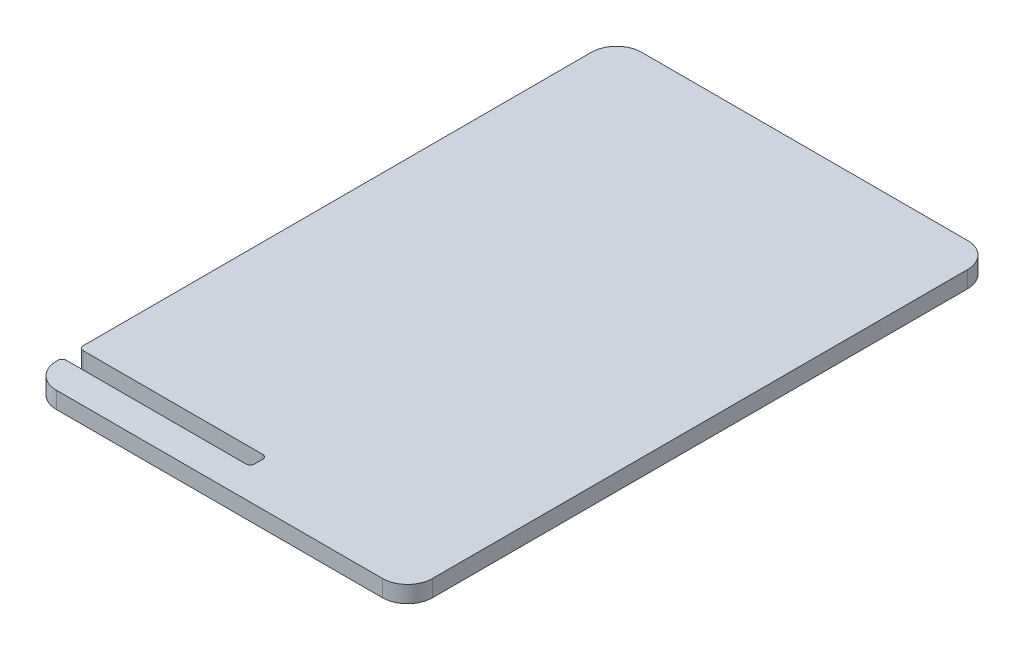
ISO-10303-21;
HEADER;
FILE_DESCRIPTION(('STEP AP214'),'2;1');
FILE_NAME('part.step','',(''),(''),'','','');
FILE_SCHEMA(('AUTOMOTIVE_DESIGN { 1 0 10303 214 1 1 1 1 }'));
ENDSEC;
DATA;
#1=APPLICATION_CONTEXT('core data for automotive mechanical design processes');
#2=APPLICATION_PROTOCOL_DEFINITION('international standard','automotive_design',2000,#1);
#3=PRODUCT_CONTEXT('',#1,'mechanical');
#4=PRODUCT('Part','Part','',(#3));
#5=PRODUCT_RELATED_PRODUCT_CATEGORY('part','',(#4));
#6=PRODUCT_DEFINITION_FORMATION('','',#4);
#7=PRODUCT_DEFINITION_CONTEXT('part definition',#1,'design');
#8=PRODUCT_DEFINITION('design','',#6,#7);
#9=PRODUCT_DEFINITION_SHAPE('','',#8);
#10=(LENGTH_UNIT() NAMED_UNIT(*) SI_UNIT(.MILLI.,.METRE.));
#11=(NAMED_UNIT(*) PLANE_ANGLE_UNIT() SI_UNIT($,.RADIAN.));
#12=(NAMED_UNIT(*) SI_UNIT($,.STERADIAN.) SOLID_ANGLE_UNIT());
#13=UNCERTAINTY_MEASURE_WITH_UNIT(LENGTH_MEASURE(1.E-05),#10,'distance_accuracy_value','');
#14=(GEOMETRIC_REPRESENTATION_CONTEXT(3) GLOBAL_UNCERTAINTY_ASSIGNED_CONTEXT((#13)) GLOBAL_UNIT_ASSIGNED_CONTEXT((#10,
#11,#12)) REPRESENTATION_CONTEXT('',''));
#15=CARTESIAN_POINT('',(0.,0.,0.));
#16=DIRECTION('',(0.,0.,1.));
#17=DIRECTION('',(1.,0.,0.));
#18=AXIS2_PLACEMENT_3D('',#15,#16,#17);
#19=CARTESIAN_POINT('',(-22.5,2.,-35.3062315740794));
#20=DIRECTION('',(1.,0.,0.));
#21=DIRECTION('',(0.,0.,-1.));
#22=AXIS2_PLACEMENT_3D('',#19,#20,#21);
#23=PLANE('',#22);
#24=DIRECTION('',(0.,0.,1.));
#25=VECTOR('',#24,1.);
#26=CARTESIAN_POINT('',(-22.5,0.,-35.3062315740794));
#27=LINE('',#26,#25);
#28=CARTESIAN_POINT('',(-22.5,0.,-32.3062315740794));
#29=VERTEX_POINT('',#28);
#30=CARTESIAN_POINT('',(-22.5,0.,28.5));
#31=VERTEX_POINT('',#30);
#32=EDGE_CURVE('E186',#29,#31,#27,.T.);
#33=ORIENTED_EDGE('',*,*,#32,.T.);
#34=DIRECTION('',(0.,1.,0.));
#35=VECTOR('',#34,1.);
#36=CARTESIAN_POINT('',(-22.5,2.,28.5));
#37=LINE('',#36,#35);
#38=CARTESIAN_POINT('',(-22.5,2.,28.5));
#39=VERTEX_POINT('',#38);
#40=EDGE_CURVE('E278',#31,#39,#37,.T.);
#41=ORIENTED_EDGE('',*,*,#40,.T.);
#42=DIRECTION('',(0.,0.,1.));
#43=VECTOR('',#42,1.);
#44=CARTESIAN_POINT('',(-22.5,2.,-35.3062315740794));
#45=LINE('',#44,#43);
#46=CARTESIAN_POINT('',(-22.5,2.,-32.3062315740794));
#47=VERTEX_POINT('',#46);
#48=EDGE_CURVE('E327',#47,#39,#45,.T.);
#49=ORIENTED_EDGE('',*,*,#48,.F.);
#50=DIRECTION('',(0.,-1.,0.));
#51=VECTOR('',#50,1.);
#52=CARTESIAN_POINT('',(-22.5,2.,-32.3062315740794));
#53=LINE('',#52,#51);
#54=EDGE_CURVE('E232',#47,#29,#53,.T.);
#55=ORIENTED_EDGE('',*,*,#54,.T.);
#56=EDGE_LOOP('',(#33,#41,#49,#55));
#57=FACE_BOUND('',#56,.T.);
#58=ADVANCED_FACE('F43',(#57),#23,.F.);
#59=CARTESIAN_POINT('',(-22.5,2.,31.5));
#60=VERTEX_POINT('',#59);
#61=CARTESIAN_POINT('',(-22.5,2.,31.6937684259206));
#62=VERTEX_POINT('',#61);
#63=EDGE_CURVE('E200',#60,#62,#45,.T.);
#64=ORIENTED_EDGE('',*,*,#63,.F.);
#65=DIRECTION('',(0.,1.,0.));
#66=VECTOR('',#65,1.);
#67=CARTESIAN_POINT('',(-22.5,2.,31.5));
#68=LINE('',#67,#66);
#69=CARTESIAN_POINT('',(-22.5,0.,31.5));
#70=VERTEX_POINT('',#69);
#71=EDGE_CURVE('E256',#60,#70,#68,.F.);
#72=ORIENTED_EDGE('',*,*,#71,.T.);
#73=CARTESIAN_POINT('',(-22.5,0.,31.6937684259206));
#74=VERTEX_POINT('',#73);
#75=EDGE_CURVE('E193',#70,#74,#27,.T.);
#76=ORIENTED_EDGE('',*,*,#75,.T.);
#77=DIRECTION('',(0.,-1.,0.));
#78=VECTOR('',#77,1.);
#79=CARTESIAN_POINT('',(-22.5,2.,31.6937684259206));
#80=LINE('',#79,#78);
#81=EDGE_CURVE('E164',#74,#62,#80,.F.);
#82=ORIENTED_EDGE('',*,*,#81,.T.);
#83=EDGE_LOOP('',(#64,#72,#76,#82));
#84=FACE_BOUND('',#83,.T.);
#85=ADVANCED_FACE('F366',(#84),#23,.F.);
#86=CARTESIAN_POINT('',(-22.5,2.,34.6937684259206));
#87=DIRECTION('',(0.,0.,-1.));
#88=DIRECTION('',(-1.,0.,0.));
#89=AXIS2_PLACEMENT_3D('',#86,#87,#88);
#90=PLANE('',#89);
#91=DIRECTION('',(1.,0.,0.));
#92=VECTOR('',#91,1.);
#93=CARTESIAN_POINT('',(-22.5,2.,34.6937684259206));
#94=LINE('',#93,#92);
#95=CARTESIAN_POINT('',(-19.5,2.,34.6937684259206));
#96=VERTEX_POINT('',#95);
#97=CARTESIAN_POINT('',(19.5,2.,34.6937684259206));
#98=VERTEX_POINT('',#97);
#99=EDGE_CURVE('E177',#96,#98,#94,.T.);
#100=ORIENTED_EDGE('',*,*,#99,.F.);
#101=DIRECTION('',(0.,-1.,0.));
#102=VECTOR('',#101,1.);
#103=CARTESIAN_POINT('',(-19.5,2.,34.6937684259206));
#104=LINE('',#103,#102);
#105=CARTESIAN_POINT('',(-19.5,0.,34.6937684259206));
#106=VERTEX_POINT('',#105);
#107=EDGE_CURVE('E162',#96,#106,#104,.T.);
#108=ORIENTED_EDGE('',*,*,#107,.T.);
#109=DIRECTION('',(1.,0.,0.));
#110=VECTOR('',#109,1.);
#111=CARTESIAN_POINT('',(-22.5,0.,34.6937684259206));
#112=LINE('',#111,#110);
#113=CARTESIAN_POINT('',(19.5,0.,34.6937684259206));
#114=VERTEX_POINT('',#113);
#115=EDGE_CURVE('E174',#106,#114,#112,.T.);
#116=ORIENTED_EDGE('',*,*,#115,.T.);
#117=DIRECTION('',(0.,-1.,0.));
#118=VECTOR('',#117,1.);
#119=CARTESIAN_POINT('',(19.5,2.,34.6937684259206));
#120=LINE('',#119,#118);
#121=EDGE_CURVE('E180',#114,#98,#120,.F.);
#122=ORIENTED_EDGE('',*,*,#121,.T.);
#123=EDGE_LOOP('',(#100,#108,#116,#122));
#124=FACE_BOUND('',#123,.T.);
#125=ADVANCED_FACE('F173',(#124),#90,.F.);
#126=CARTESIAN_POINT('',(22.5,2.,-35.3062315740794));
#127=DIRECTION('',(-1.,0.,0.));
#128=DIRECTION('',(0.,0.,1.));
#129=AXIS2_PLACEMENT_3D('',#126,#127,#128);
#130=PLANE('',#129);
#131=DIRECTION('',(0.,0.,-1.));
#132=VECTOR('',#131,1.);
#133=CARTESIAN_POINT('',(22.5,2.,-35.3062315740794));
#134=LINE('',#133,#132);
#135=CARTESIAN_POINT('',(22.5,2.,31.6937684259206));
#136=VERTEX_POINT('',#135);
#137=CARTESIAN_POINT('',(22.5,2.,-32.3062315740794));
#138=VERTEX_POINT('',#137);
#139=EDGE_CURVE('E333',#136,#138,#134,.T.);
#140=ORIENTED_EDGE('',*,*,#139,.F.);
#141=DIRECTION('',(0.,-1.,0.));
#142=VECTOR('',#141,1.);
#143=CARTESIAN_POINT('',(22.5,2.,31.6937684259206));
#144=LINE('',#143,#142);
#145=CARTESIAN_POINT('',(22.5,0.,31.6937684259206));
#146=VERTEX_POINT('',#145);
#147=EDGE_CURVE('E228',#136,#146,#144,.T.);
#148=ORIENTED_EDGE('',*,*,#147,.T.);
#149=DIRECTION('',(0.,0.,-1.));
#150=VECTOR('',#149,1.);
#151=CARTESIAN_POINT('',(22.5,0.,-35.3062315740794));
#152=LINE('',#151,#150);
#153=CARTESIAN_POINT('',(22.5,0.,-32.3062315740794));
#154=VERTEX_POINT('',#153);
#155=EDGE_CURVE('E185',#146,#154,#152,.T.);
#156=ORIENTED_EDGE('',*,*,#155,.T.);
#157=DIRECTION('',(0.,-1.,0.));
#158=VECTOR('',#157,1.);
#159=CARTESIAN_POINT('',(22.5,2.,-32.3062315740794));
#160=LINE('',#159,#158);
#161=EDGE_CURVE('E225',#154,#138,#160,.F.);
#162=ORIENTED_EDGE('',*,*,#161,.T.);
#163=EDGE_LOOP('',(#140,#148,#156,#162));
#164=FACE_BOUND('',#163,.T.);
#165=ADVANCED_FACE('F357',(#164),#130,.F.);
#166=CARTESIAN_POINT('',(-22.5,2.,-35.3062315740794));
#167=DIRECTION('',(0.,0.,1.));
#168=DIRECTION('',(1.,0.,0.));
#169=AXIS2_PLACEMENT_3D('',#166,#167,#168);
#170=PLANE('',#169);
#171=DIRECTION('',(-1.,0.,0.));
#172=VECTOR('',#171,1.);
#173=CARTESIAN_POINT('',(-22.5,0.,-35.3062315740794));
#174=LINE('',#173,#172);
#175=CARTESIAN_POINT('',(19.5,0.,-35.3062315740794));
#176=VERTEX_POINT('',#175);
#177=CARTESIAN_POINT('',(-19.5,0.,-35.3062315740794));
#178=VERTEX_POINT('',#177);
#179=EDGE_CURVE('E191',#176,#178,#174,.T.);
#180=ORIENTED_EDGE('',*,*,#179,.T.);
#181=DIRECTION('',(0.,-1.,0.));
#182=VECTOR('',#181,1.);
#183=CARTESIAN_POINT('',(-19.5,2.,-35.3062315740794));
#184=LINE('',#183,#182);
#185=CARTESIAN_POINT('',(-19.5,2.,-35.3062315740794));
#186=VERTEX_POINT('',#185);
#187=EDGE_CURVE('E240',#178,#186,#184,.F.);
#188=ORIENTED_EDGE('',*,*,#187,.T.);
#189=DIRECTION('',(-1.,0.,0.));
#190=VECTOR('',#189,1.);
#191=CARTESIAN_POINT('',(-22.5,2.,-35.3062315740794));
#192=LINE('',#191,#190);
#193=CARTESIAN_POINT('',(19.5,2.,-35.3062315740794));
#194=VERTEX_POINT('',#193);
#195=EDGE_CURVE('E202',#194,#186,#192,.T.);
#196=ORIENTED_EDGE('',*,*,#195,.F.);
#197=DIRECTION('',(0.,-1.,0.));
#198=VECTOR('',#197,1.);
#199=CARTESIAN_POINT('',(19.5,2.,-35.3062315740794));
#200=LINE('',#199,#198);
#201=EDGE_CURVE('E236',#194,#176,#200,.T.);
#202=ORIENTED_EDGE('',*,*,#201,.T.);
#203=EDGE_LOOP('',(#180,#188,#196,#202));
#204=FACE_BOUND('',#203,.T.);
#205=ADVANCED_FACE('F351',(#204),#170,.F.);
#206=CARTESIAN_POINT('',(0.,2.,0.));
#207=DIRECTION('',(0.,1.,0.));
#208=DIRECTION('',(0.,0.,1.));
#209=AXIS2_PLACEMENT_3D('',#206,#207,#208);
#210=PLANE('',#209);
#211=DIRECTION('',(1.,0.,0.));
#212=VECTOR('',#211,1.);
#213=CARTESIAN_POINT('',(-22.5,2.,31.));
#214=LINE('',#213,#212);
#215=CARTESIAN_POINT('',(-22.,2.,31.));
#216=VERTEX_POINT('',#215);
#217=CARTESIAN_POINT('',(-0.500000000000007,2.,31.));
#218=VERTEX_POINT('',#217);
#219=EDGE_CURVE('E305',#216,#218,#214,.T.);
#220=ORIENTED_EDGE('',*,*,#219,.F.);
#221=CARTESIAN_POINT('',(-22.,2.,31.5));
#222=DIRECTION('',(0.,1.,0.));
#223=DIRECTION('',(0.,0.,1.));
#224=AXIS2_PLACEMENT_3D('',#221,#222,#223);
#225=CIRCLE('',#224,0.5);
#226=EDGE_CURVE('E253',#216,#60,#225,.T.);
#227=ORIENTED_EDGE('',*,*,#226,.T.);
#228=ORIENTED_EDGE('',*,*,#63,.T.);
#229=CARTESIAN_POINT('',(-19.5,2.,31.6937684259206));
#230=DIRECTION('',(0.,1.,0.));
#231=DIRECTION('',(0.,0.,1.));
#232=AXIS2_PLACEMENT_3D('',#229,#230,#231);
#233=CIRCLE('',#232,3.);
#234=EDGE_CURVE('E222',#62,#96,#233,.T.);
#235=ORIENTED_EDGE('',*,*,#234,.T.);
#236=ORIENTED_EDGE('',*,*,#99,.T.);
#237=CARTESIAN_POINT('',(19.5,2.,31.6937684259206));
#238=DIRECTION('',(0.,1.,0.));
#239=DIRECTION('',(0.,0.,1.));
#240=AXIS2_PLACEMENT_3D('',#237,#238,#239);
#241=CIRCLE('',#240,3.);
#242=EDGE_CURVE('E219',#98,#136,#241,.T.);
#243=ORIENTED_EDGE('',*,*,#242,.T.);
#244=ORIENTED_EDGE('',*,*,#139,.T.);
#245=CARTESIAN_POINT('',(19.5,2.,-32.3062315740794));
#246=DIRECTION('',(0.,1.,0.));
#247=DIRECTION('',(0.,0.,1.));
#248=AXIS2_PLACEMENT_3D('',#245,#246,#247);
#249=CIRCLE('',#248,3.);
#250=EDGE_CURVE('E213',#138,#194,#249,.T.);
#251=ORIENTED_EDGE('',*,*,#250,.T.);
#252=ORIENTED_EDGE('',*,*,#195,.T.);
#253=CARTESIAN_POINT('',(-19.5,2.,-32.3062315740794));
#254=DIRECTION('',(0.,1.,0.));
#255=DIRECTION('',(0.,0.,1.));
#256=AXIS2_PLACEMENT_3D('',#253,#254,#255);
#257=CIRCLE('',#256,3.);
#258=EDGE_CURVE('E216',#186,#47,#257,.T.);
#259=ORIENTED_EDGE('',*,*,#258,.T.);
#260=ORIENTED_EDGE('',*,*,#48,.T.);
#261=CARTESIAN_POINT('',(-22.,2.,28.5));
#262=DIRECTION('',(0.,1.,0.));
#263=DIRECTION('',(0.,0.,1.));
#264=AXIS2_PLACEMENT_3D('',#261,#262,#263);
#265=CIRCLE('',#264,0.5);
#266=CARTESIAN_POINT('',(-22.,2.,29.));
#267=VERTEX_POINT('',#266);
#268=EDGE_CURVE('E250',#39,#267,#265,.T.);
#269=ORIENTED_EDGE('',*,*,#268,.T.);
#270=DIRECTION('',(-1.,0.,0.));
#271=VECTOR('',#270,1.);
#272=CARTESIAN_POINT('',(-22.5,2.,29.));
#273=LINE('',#272,#271);
#274=CARTESIAN_POINT('',(-0.500000000000007,2.,29.));
#275=VERTEX_POINT('',#274);
#276=EDGE_CURVE('E296',#275,#267,#273,.T.);
#277=ORIENTED_EDGE('',*,*,#276,.F.);
#278=CARTESIAN_POINT('',(-0.5,2.,29.5));
#279=DIRECTION('',(0.,1.,0.));
#280=DIRECTION('',(0.,0.,1.));
#281=AXIS2_PLACEMENT_3D('',#278,#279,#280);
#282=CIRCLE('',#281,0.5);
#283=CARTESIAN_POINT('',(0.,2.,29.5));
#284=VERTEX_POINT('',#283);
#285=EDGE_CURVE('E52',#275,#284,#282,.F.);
#286=ORIENTED_EDGE('',*,*,#285,.T.);
#287=DIRECTION('',(0.,0.,-1.));
#288=VECTOR('',#287,1.);
#289=CARTESIAN_POINT('',(0.,2.,29.));
#290=LINE('',#289,#288);
#291=CARTESIAN_POINT('',(0.,2.,30.5));
#292=VERTEX_POINT('',#291);
#293=EDGE_CURVE('E294',#292,#284,#290,.T.);
#294=ORIENTED_EDGE('',*,*,#293,.F.);
#295=CARTESIAN_POINT('',(-0.5,2.,30.5));
#296=DIRECTION('',(0.,1.,0.));
#297=DIRECTION('',(0.,0.,1.));
#298=AXIS2_PLACEMENT_3D('',#295,#296,#297);
#299=CIRCLE('',#298,0.5);
#300=EDGE_CURVE('E282',#292,#218,#299,.F.);
#301=ORIENTED_EDGE('',*,*,#300,.T.);
#302=EDGE_LOOP('',(#220,#227,#228,#235,#236,#243,#244,#251,#252,#259,#260,#269,#277,#286,#294,#301));
#303=FACE_BOUND('',#302,.T.);
#304=ADVANCED_FACE('F293',(#303),#210,.T.);
#305=CARTESIAN_POINT('',(0.,0.,0.));
#306=DIRECTION('',(0.,1.,0.));
#307=DIRECTION('',(0.,0.,1.));
#308=AXIS2_PLACEMENT_3D('',#305,#306,#307);
#309=PLANE('',#308);
#310=ORIENTED_EDGE('',*,*,#75,.F.);
#311=CARTESIAN_POINT('',(-22.,0.,31.5));
#312=DIRECTION('',(0.,1.,0.));
#313=DIRECTION('',(0.,0.,1.));
#314=AXIS2_PLACEMENT_3D('',#311,#312,#313);
#315=CIRCLE('',#314,0.5);
#316=CARTESIAN_POINT('',(-22.,0.,31.));
#317=VERTEX_POINT('',#316);
#318=EDGE_CURVE('E261',#70,#317,#315,.F.);
#319=ORIENTED_EDGE('',*,*,#318,.T.);
#320=DIRECTION('',(-1.,0.,0.));
#321=VECTOR('',#320,1.);
#322=CARTESIAN_POINT('',(-22.5,0.,31.));
#323=LINE('',#322,#321);
#324=CARTESIAN_POINT('',(-0.5,0.,31.));
#325=VERTEX_POINT('',#324);
#326=EDGE_CURVE('E313',#325,#317,#323,.T.);
#327=ORIENTED_EDGE('',*,*,#326,.F.);
#328=CARTESIAN_POINT('',(-0.5,0.,30.5));
#329=DIRECTION('',(0.,1.,0.));
#330=DIRECTION('',(0.,0.,1.));
#331=AXIS2_PLACEMENT_3D('',#328,#329,#330);
#332=CIRCLE('',#331,0.5);
#333=CARTESIAN_POINT('',(0.,0.,30.5));
#334=VERTEX_POINT('',#333);
#335=EDGE_CURVE('E285',#325,#334,#332,.T.);
#336=ORIENTED_EDGE('',*,*,#335,.T.);
#337=DIRECTION('',(0.,0.,1.));
#338=VECTOR('',#337,1.);
#339=CARTESIAN_POINT('',(0.,0.,29.));
#340=LINE('',#339,#338);
#341=CARTESIAN_POINT('',(0.,0.,29.5));
#342=VERTEX_POINT('',#341);
#343=EDGE_CURVE('E314',#342,#334,#340,.T.);
#344=ORIENTED_EDGE('',*,*,#343,.F.);
#345=CARTESIAN_POINT('',(-0.5,0.,29.5));
#346=DIRECTION('',(0.,1.,0.));
#347=DIRECTION('',(0.,0.,1.));
#348=AXIS2_PLACEMENT_3D('',#345,#346,#347);
#349=CIRCLE('',#348,0.5);
#350=CARTESIAN_POINT('',(-0.5,0.,29.));
#351=VERTEX_POINT('',#350);
#352=EDGE_CURVE('E11',#342,#351,#349,.T.);
#353=ORIENTED_EDGE('',*,*,#352,.T.);
#354=DIRECTION('',(1.,0.,0.));
#355=VECTOR('',#354,1.);
#356=CARTESIAN_POINT('',(-22.5,0.,29.));
#357=LINE('',#356,#355);
#358=CARTESIAN_POINT('',(-22.,0.,29.));
#359=VERTEX_POINT('',#358);
#360=EDGE_CURVE('E311',#359,#351,#357,.T.);
#361=ORIENTED_EDGE('',*,*,#360,.F.);
#362=CARTESIAN_POINT('',(-22.,0.,28.5));
#363=DIRECTION('',(0.,1.,0.));
#364=DIRECTION('',(0.,0.,1.));
#365=AXIS2_PLACEMENT_3D('',#362,#363,#364);
#366=CIRCLE('',#365,0.5);
#367=EDGE_CURVE('E59',#359,#31,#366,.F.);
#368=ORIENTED_EDGE('',*,*,#367,.T.);
#369=ORIENTED_EDGE('',*,*,#32,.F.);
#370=CARTESIAN_POINT('',(-19.5,0.,-32.3062315740794));
#371=DIRECTION('',(0.,1.,0.));
#372=DIRECTION('',(0.,0.,1.));
#373=AXIS2_PLACEMENT_3D('',#370,#371,#372);
#374=CIRCLE('',#373,3.);
#375=EDGE_CURVE('E206',#29,#178,#374,.F.);
#376=ORIENTED_EDGE('',*,*,#375,.T.);
#377=ORIENTED_EDGE('',*,*,#179,.F.);
#378=CARTESIAN_POINT('',(19.5,0.,-32.3062315740794));
#379=DIRECTION('',(0.,1.,0.));
#380=DIRECTION('',(0.,0.,1.));
#381=AXIS2_PLACEMENT_3D('',#378,#379,#380);
#382=CIRCLE('',#381,3.);
#383=EDGE_CURVE('E179',#176,#154,#382,.F.);
#384=ORIENTED_EDGE('',*,*,#383,.T.);
#385=ORIENTED_EDGE('',*,*,#155,.F.);
#386=CARTESIAN_POINT('',(19.5,0.,31.6937684259206));
#387=DIRECTION('',(0.,1.,0.));
#388=DIRECTION('',(0.,0.,1.));
#389=AXIS2_PLACEMENT_3D('',#386,#387,#388);
#390=CIRCLE('',#389,3.);
#391=EDGE_CURVE('E168',#146,#114,#390,.F.);
#392=ORIENTED_EDGE('',*,*,#391,.T.);
#393=ORIENTED_EDGE('',*,*,#115,.F.);
#394=CARTESIAN_POINT('',(-19.5,0.,31.6937684259206));
#395=DIRECTION('',(0.,1.,0.));
#396=DIRECTION('',(0.,0.,1.));
#397=AXIS2_PLACEMENT_3D('',#394,#395,#396);
#398=CIRCLE('',#397,3.);
#399=EDGE_CURVE('E158',#106,#74,#398,.F.);
#400=ORIENTED_EDGE('',*,*,#399,.T.);
#401=EDGE_LOOP('',(#310,#319,#327,#336,#344,#353,#361,#368,#369,#376,#377,#384,#385,#392,#393,#400));
#402=FACE_BOUND('',#401,.T.);
#403=ADVANCED_FACE('F182',(#402),#309,.F.);
#404=CARTESIAN_POINT('',(-22.5,-22.588713996153,29.));
#405=DIRECTION('',(0.,0.,-1.));
#406=DIRECTION('',(-1.,0.,0.));
#407=AXIS2_PLACEMENT_3D('',#404,#405,#406);
#408=PLANE('',#407);
#409=ORIENTED_EDGE('',*,*,#360,.T.);
#410=DIRECTION('',(0.,1.,0.));
#411=VECTOR('',#410,1.);
#412=CARTESIAN_POINT('',(-0.5,2.,29.));
#413=LINE('',#412,#411);
#414=EDGE_CURVE('E274',#351,#275,#413,.T.);
#415=ORIENTED_EDGE('',*,*,#414,.T.);
#416=ORIENTED_EDGE('',*,*,#276,.T.);
#417=DIRECTION('',(0.,1.,0.));
#418=VECTOR('',#417,1.);
#419=CARTESIAN_POINT('',(-22.,-22.588713996153,29.));
#420=LINE('',#419,#418);
#421=EDGE_CURVE('E271',#267,#359,#420,.F.);
#422=ORIENTED_EDGE('',*,*,#421,.T.);
#423=EDGE_LOOP('',(#409,#415,#416,#422));
#424=FACE_BOUND('',#423,.T.);
#425=ADVANCED_FACE('F309',(#424),#408,.F.);
#426=CARTESIAN_POINT('',(0.,-22.588713996153,29.));
#427=DIRECTION('',(1.,0.,0.));
#428=DIRECTION('',(0.,0.,-1.));
#429=AXIS2_PLACEMENT_3D('',#426,#427,#428);
#430=PLANE('',#429);
#431=ORIENTED_EDGE('',*,*,#343,.T.);
#432=DIRECTION('',(0.,1.,0.));
#433=VECTOR('',#432,1.);
#434=CARTESIAN_POINT('',(0.,2.,30.5));
#435=LINE('',#434,#433);
#436=EDGE_CURVE('E267',#334,#292,#435,.T.);
#437=ORIENTED_EDGE('',*,*,#436,.T.);
#438=ORIENTED_EDGE('',*,*,#293,.T.);
#439=DIRECTION('',(0.,1.,0.));
#440=VECTOR('',#439,1.);
#441=CARTESIAN_POINT('',(0.,0.,29.5));
#442=LINE('',#441,#440);
#443=EDGE_CURVE('E264',#284,#342,#442,.F.);
#444=ORIENTED_EDGE('',*,*,#443,.T.);
#445=EDGE_LOOP('',(#431,#437,#438,#444));
#446=FACE_BOUND('',#445,.T.);
#447=ADVANCED_FACE('F302',(#446),#430,.F.);
#448=CARTESIAN_POINT('',(-22.5,-22.588713996153,31.));
#449=DIRECTION('',(0.,0.,1.));
#450=DIRECTION('',(1.,0.,0.));
#451=AXIS2_PLACEMENT_3D('',#448,#449,#450);
#452=PLANE('',#451);
#453=ORIENTED_EDGE('',*,*,#326,.T.);
#454=DIRECTION('',(0.,1.,0.));
#455=VECTOR('',#454,1.);
#456=CARTESIAN_POINT('',(-22.,-22.588713996153,31.));
#457=LINE('',#456,#455);
#458=EDGE_CURVE('E246',#317,#216,#457,.T.);
#459=ORIENTED_EDGE('',*,*,#458,.T.);
#460=ORIENTED_EDGE('',*,*,#219,.T.);
#461=DIRECTION('',(0.,1.,0.));
#462=VECTOR('',#461,1.);
#463=CARTESIAN_POINT('',(-0.5,0.,31.));
#464=LINE('',#463,#462);
#465=EDGE_CURVE('E243',#218,#325,#464,.F.);
#466=ORIENTED_EDGE('',*,*,#465,.T.);
#467=EDGE_LOOP('',(#453,#459,#460,#466));
#468=FACE_BOUND('',#467,.T.);
#469=ADVANCED_FACE('F374',(#468),#452,.F.);
#470=CARTESIAN_POINT('',(-19.5,2.,31.6937684259206));
#471=DIRECTION('',(0.,-1.,0.));
#472=DIRECTION('',(0.,0.,-1.));
#473=AXIS2_PLACEMENT_3D('',#470,#471,#472);
#474=CYLINDRICAL_SURFACE('',#473,3.);
#475=ORIENTED_EDGE('',*,*,#234,.F.);
#476=ORIENTED_EDGE('',*,*,#81,.F.);
#477=ORIENTED_EDGE('',*,*,#399,.F.);
#478=ORIENTED_EDGE('',*,*,#107,.F.);
#479=EDGE_LOOP('',(#475,#476,#477,#478));
#480=FACE_BOUND('',#479,.T.);
#481=ADVANCED_FACE('F161',(#480),#474,.T.);
#482=CARTESIAN_POINT('',(19.5,2.,31.6937684259206));
#483=DIRECTION('',(0.,-1.,0.));
#484=DIRECTION('',(0.,0.,-1.));
#485=AXIS2_PLACEMENT_3D('',#482,#483,#484);
#486=CYLINDRICAL_SURFACE('',#485,3.);
#487=ORIENTED_EDGE('',*,*,#242,.F.);
#488=ORIENTED_EDGE('',*,*,#121,.F.);
#489=ORIENTED_EDGE('',*,*,#391,.F.);
#490=ORIENTED_EDGE('',*,*,#147,.F.);
#491=EDGE_LOOP('',(#487,#488,#489,#490));
#492=FACE_BOUND('',#491,.T.);
#493=ADVANCED_FACE('F361',(#492),#486,.T.);
#494=CARTESIAN_POINT('',(-19.5,2.,-32.3062315740794));
#495=DIRECTION('',(0.,-1.,0.));
#496=DIRECTION('',(0.,0.,-1.));
#497=AXIS2_PLACEMENT_3D('',#494,#495,#496);
#498=CYLINDRICAL_SURFACE('',#497,3.);
#499=ORIENTED_EDGE('',*,*,#258,.F.);
#500=ORIENTED_EDGE('',*,*,#187,.F.);
#501=ORIENTED_EDGE('',*,*,#375,.F.);
#502=ORIENTED_EDGE('',*,*,#54,.F.);
#503=EDGE_LOOP('',(#499,#500,#501,#502));
#504=FACE_BOUND('',#503,.T.);
#505=ADVANCED_FACE('F347',(#504),#498,.T.);
#506=CARTESIAN_POINT('',(19.5,2.,-32.3062315740794));
#507=DIRECTION('',(0.,-1.,0.));
#508=DIRECTION('',(0.,0.,-1.));
#509=AXIS2_PLACEMENT_3D('',#506,#507,#508);
#510=CYLINDRICAL_SURFACE('',#509,3.);
#511=ORIENTED_EDGE('',*,*,#250,.F.);
#512=ORIENTED_EDGE('',*,*,#161,.F.);
#513=ORIENTED_EDGE('',*,*,#383,.F.);
#514=ORIENTED_EDGE('',*,*,#201,.F.);
#515=EDGE_LOOP('',(#511,#512,#513,#514));
#516=FACE_BOUND('',#515,.T.);
#517=ADVANCED_FACE('F353',(#516),#510,.T.);
#518=CARTESIAN_POINT('',(-22.,-22.588713996153,31.5));
#519=DIRECTION('',(0.,1.,0.));
#520=DIRECTION('',(0.,0.,1.));
#521=AXIS2_PLACEMENT_3D('',#518,#519,#520);
#522=CYLINDRICAL_SURFACE('',#521,0.5);
#523=ORIENTED_EDGE('',*,*,#318,.F.);
#524=ORIENTED_EDGE('',*,*,#71,.F.);
#525=ORIENTED_EDGE('',*,*,#226,.F.);
#526=ORIENTED_EDGE('',*,*,#458,.F.);
#527=EDGE_LOOP('',(#523,#524,#525,#526));
#528=FACE_BOUND('',#527,.T.);
#529=ADVANCED_FACE('F372',(#528),#522,.T.);
#530=CARTESIAN_POINT('',(-0.5,-22.588713996153,30.5));
#531=DIRECTION('',(0.,-1.,0.));
#532=DIRECTION('',(0.,0.,-1.));
#533=AXIS2_PLACEMENT_3D('',#530,#531,#532);
#534=CYLINDRICAL_SURFACE('',#533,0.5);
#535=ORIENTED_EDGE('',*,*,#335,.F.);
#536=ORIENTED_EDGE('',*,*,#465,.F.);
#537=ORIENTED_EDGE('',*,*,#300,.F.);
#538=ORIENTED_EDGE('',*,*,#436,.F.);
#539=EDGE_LOOP('',(#535,#536,#537,#538));
#540=FACE_BOUND('',#539,.T.);
#541=ADVANCED_FACE('F378',(#540),#534,.F.);
#542=CARTESIAN_POINT('',(-0.5,-22.588713996153,29.5));
#543=DIRECTION('',(0.,-1.,0.));
#544=DIRECTION('',(0.,0.,-1.));
#545=AXIS2_PLACEMENT_3D('',#542,#543,#544);
#546=CYLINDRICAL_SURFACE('',#545,0.5);
#547=ORIENTED_EDGE('',*,*,#352,.F.);
#548=ORIENTED_EDGE('',*,*,#443,.F.);
#549=ORIENTED_EDGE('',*,*,#285,.F.);
#550=ORIENTED_EDGE('',*,*,#414,.F.);
#551=EDGE_LOOP('',(#547,#548,#549,#550));
#552=FACE_BOUND('',#551,.T.);
#553=ADVANCED_FACE('F307',(#552),#546,.F.);
#554=CARTESIAN_POINT('',(-22.,2.,28.5));
#555=DIRECTION('',(0.,1.,0.));
#556=DIRECTION('',(0.,0.,1.));
#557=AXIS2_PLACEMENT_3D('',#554,#555,#556);
#558=CYLINDRICAL_SURFACE('',#557,0.5);
#559=ORIENTED_EDGE('',*,*,#367,.F.);
#560=ORIENTED_EDGE('',*,*,#421,.F.);
#561=ORIENTED_EDGE('',*,*,#268,.F.);
#562=ORIENTED_EDGE('',*,*,#40,.F.);
#563=EDGE_LOOP('',(#559,#560,#561,#562));
#564=FACE_BOUND('',#563,.T.);
#565=ADVANCED_FACE('F45',(#564),#558,.T.);
#566=CLOSED_SHELL('',(#58,#85,#125,#165,#205,#304,#403,#425,#447,#469,#481,#493,#505,#517,#529,
#541,#553,#565));
#567=MANIFOLD_SOLID_BREP('B2',#566);
#568=ADVANCED_BREP_SHAPE_REPRESENTATION('',(#18,#567),#14);
#569=SHAPE_DEFINITION_REPRESENTATION(#9,#568);
ENDSEC;
END-ISO-10303-21;
